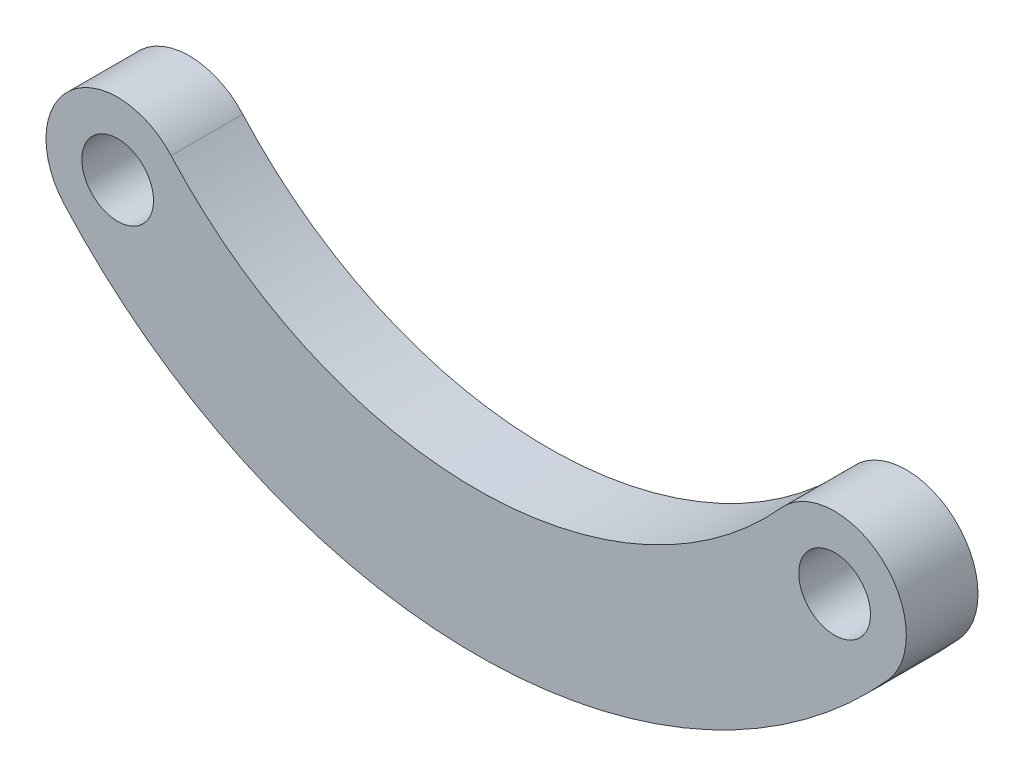
ISO-10303-21;
HEADER;
FILE_DESCRIPTION(('STEP AP214'),'2;1');
FILE_NAME('part.step','',(''),(''),'','','');
FILE_SCHEMA(('AUTOMOTIVE_DESIGN { 1 0 10303 214 1 1 1 1 }'));
ENDSEC;
DATA;
#1=APPLICATION_CONTEXT('core data for automotive mechanical design processes');
#2=APPLICATION_PROTOCOL_DEFINITION('international standard','automotive_design',2000,#1);
#3=PRODUCT_CONTEXT('',#1,'mechanical');
#4=PRODUCT('Part','Part','',(#3));
#5=PRODUCT_RELATED_PRODUCT_CATEGORY('part','',(#4));
#6=PRODUCT_DEFINITION_FORMATION('','',#4);
#7=PRODUCT_DEFINITION_CONTEXT('part definition',#1,'design');
#8=PRODUCT_DEFINITION('design','',#6,#7);
#9=PRODUCT_DEFINITION_SHAPE('','',#8);
#10=(LENGTH_UNIT() NAMED_UNIT(*) SI_UNIT(.MILLI.,.METRE.));
#11=(NAMED_UNIT(*) PLANE_ANGLE_UNIT() SI_UNIT($,.RADIAN.));
#12=(NAMED_UNIT(*) SI_UNIT($,.STERADIAN.) SOLID_ANGLE_UNIT());
#13=UNCERTAINTY_MEASURE_WITH_UNIT(LENGTH_MEASURE(1.E-05),#10,'distance_accuracy_value','');
#14=(GEOMETRIC_REPRESENTATION_CONTEXT(3) GLOBAL_UNCERTAINTY_ASSIGNED_CONTEXT((#13)) GLOBAL_UNIT_ASSIGNED_CONTEXT((#10,
#11,#12)) REPRESENTATION_CONTEXT('',''));
#15=CARTESIAN_POINT('',(0.,0.,0.));
#16=DIRECTION('',(0.,0.,1.));
#17=DIRECTION('',(1.,0.,0.));
#18=AXIS2_PLACEMENT_3D('',#15,#16,#17);
#19=CARTESIAN_POINT('',(-47.625,-42.6471224925101,19.05));
#20=DIRECTION('',(0.,0.,-1.));
#21=DIRECTION('',(-1.,0.,0.));
#22=AXIS2_PLACEMENT_3D('',#19,#20,#21);
#23=PLANE('',#22);
#24=CARTESIAN_POINT('',(0.,0.,19.05));
#25=DIRECTION('',(0.,0.,-1.));
#26=DIRECTION('',(-1.,0.,0.));
#27=AXIS2_PLACEMENT_3D('',#24,#25,#26);
#28=CIRCLE('',#27,108.808010025045);
#29=CARTESIAN_POINT('',(81.0583783750071,-72.585965178019,19.05));
#30=VERTEX_POINT('',#29);
#31=CARTESIAN_POINT('',(-81.058378375007,-72.585965178019,19.05));
#32=VERTEX_POINT('',#31);
#33=EDGE_CURVE('E89',#30,#32,#28,.T.);
#34=ORIENTED_EDGE('',*,*,#33,.T.);
#35=CARTESIAN_POINT('',(-95.25,-85.2942449850201,19.05));
#36=DIRECTION('',(0.,0.,1.));
#37=DIRECTION('',(1.,0.,0.));
#38=AXIS2_PLACEMENT_3D('',#35,#36,#37);
#39=CIRCLE('',#38,19.05);
#40=CARTESIAN_POINT('',(-109.441621624993,-98.0025247920213,19.05));
#41=VERTEX_POINT('',#40);
#42=EDGE_CURVE('E84',#32,#41,#39,.T.);
#43=ORIENTED_EDGE('',*,*,#42,.T.);
#44=CARTESIAN_POINT('',(0.,0.,19.05));
#45=DIRECTION('',(0.,0.,1.));
#46=DIRECTION('',(-1.,0.,0.));
#47=AXIS2_PLACEMENT_3D('',#44,#45,#46);
#48=CIRCLE('',#47,146.908010025045);
#49=CARTESIAN_POINT('',(109.441621624993,-98.0025247920212,19.05));
#50=VERTEX_POINT('',#49);
#51=EDGE_CURVE('E87',#41,#50,#48,.T.);
#52=ORIENTED_EDGE('',*,*,#51,.T.);
#53=CARTESIAN_POINT('',(95.2499999999999,-85.2942449850203,19.05));
#54=DIRECTION('',(0.,0.,1.));
#55=DIRECTION('',(-1.,0.,0.));
#56=AXIS2_PLACEMENT_3D('',#53,#54,#55);
#57=CIRCLE('',#56,19.05);
#58=EDGE_CURVE('E54',#50,#30,#57,.T.);
#59=ORIENTED_EDGE('',*,*,#58,.T.);
#60=EDGE_LOOP('',(#34,#43,#52,#59));
#61=FACE_BOUND('',#60,.T.);
#62=CARTESIAN_POINT('',(-95.25,-85.2942449850201,19.05));
#63=DIRECTION('',(0.,0.,1.));
#64=DIRECTION('',(1.,0.,0.));
#65=AXIS2_PLACEMENT_3D('',#62,#63,#64);
#66=CIRCLE('',#65,9.52500000000001);
#67=CARTESIAN_POINT('',(-104.775,-85.2942449850201,19.05));
#68=VERTEX_POINT('',#67);
#69=EDGE_CURVE('E104',#68,#68,#66,.T.);
#70=ORIENTED_EDGE('',*,*,#69,.F.);
#71=EDGE_LOOP('',(#70));
#72=FACE_BOUND('',#71,.T.);
#73=CARTESIAN_POINT('',(95.2499999999999,-85.2942449850203,19.05));
#74=DIRECTION('',(0.,0.,1.));
#75=DIRECTION('',(-1.,0.,0.));
#76=AXIS2_PLACEMENT_3D('',#73,#74,#75);
#77=CIRCLE('',#76,9.52500000000001);
#78=CARTESIAN_POINT('',(85.7249999999999,-85.2942449850203,19.05));
#79=VERTEX_POINT('',#78);
#80=EDGE_CURVE('E119',#79,#79,#77,.T.);
#81=ORIENTED_EDGE('',*,*,#80,.F.);
#82=EDGE_LOOP('',(#81));
#83=FACE_BOUND('',#82,.T.);
#84=ADVANCED_FACE('F37',(#61,#72,#83),#23,.F.);
#85=CARTESIAN_POINT('',(-47.625,-42.6471224925101,0.));
#86=DIRECTION('',(0.,0.,-1.));
#87=DIRECTION('',(-1.,0.,0.));
#88=AXIS2_PLACEMENT_3D('',#85,#86,#87);
#89=PLANE('',#88);
#90=CARTESIAN_POINT('',(-95.25,-85.2942449850201,0.));
#91=DIRECTION('',(0.,0.,1.));
#92=DIRECTION('',(1.,0.,0.));
#93=AXIS2_PLACEMENT_3D('',#90,#91,#92);
#94=CIRCLE('',#93,9.52500000000001);
#95=CARTESIAN_POINT('',(-104.775,-85.2942449850201,0.));
#96=VERTEX_POINT('',#95);
#97=EDGE_CURVE('E116',#96,#96,#94,.T.);
#98=ORIENTED_EDGE('',*,*,#97,.T.);
#99=EDGE_LOOP('',(#98));
#100=FACE_BOUND('',#99,.T.);
#101=CARTESIAN_POINT('',(0.,0.,0.));
#102=DIRECTION('',(0.,0.,-1.));
#103=DIRECTION('',(-1.,0.,0.));
#104=AXIS2_PLACEMENT_3D('',#101,#102,#103);
#105=CIRCLE('',#104,108.808010025045);
#106=CARTESIAN_POINT('',(81.0583783750071,-72.585965178019,0.));
#107=VERTEX_POINT('',#106);
#108=CARTESIAN_POINT('',(-81.058378375007,-72.585965178019,0.));
#109=VERTEX_POINT('',#108);
#110=EDGE_CURVE('E101',#107,#109,#105,.T.);
#111=ORIENTED_EDGE('',*,*,#110,.F.);
#112=CARTESIAN_POINT('',(95.2499999999999,-85.2942449850203,0.));
#113=DIRECTION('',(0.,0.,1.));
#114=DIRECTION('',(-1.,0.,0.));
#115=AXIS2_PLACEMENT_3D('',#112,#113,#114);
#116=CIRCLE('',#115,19.05);
#117=CARTESIAN_POINT('',(109.441621624993,-98.0025247920212,0.));
#118=VERTEX_POINT('',#117);
#119=EDGE_CURVE('E77',#118,#107,#116,.T.);
#120=ORIENTED_EDGE('',*,*,#119,.F.);
#121=CARTESIAN_POINT('',(0.,0.,0.));
#122=DIRECTION('',(0.,0.,1.));
#123=DIRECTION('',(-1.,0.,0.));
#124=AXIS2_PLACEMENT_3D('',#121,#122,#123);
#125=CIRCLE('',#124,146.908010025045);
#126=CARTESIAN_POINT('',(-109.441621624993,-98.0025247920213,0.));
#127=VERTEX_POINT('',#126);
#128=EDGE_CURVE('E71',#127,#118,#125,.T.);
#129=ORIENTED_EDGE('',*,*,#128,.F.);
#130=CARTESIAN_POINT('',(-95.25,-85.2942449850201,0.));
#131=DIRECTION('',(0.,0.,1.));
#132=DIRECTION('',(1.,0.,0.));
#133=AXIS2_PLACEMENT_3D('',#130,#131,#132);
#134=CIRCLE('',#133,19.05);
#135=EDGE_CURVE('E93',#109,#127,#134,.T.);
#136=ORIENTED_EDGE('',*,*,#135,.F.);
#137=EDGE_LOOP('',(#111,#120,#129,#136));
#138=FACE_BOUND('',#137,.T.);
#139=CARTESIAN_POINT('',(95.2499999999999,-85.2942449850203,0.));
#140=DIRECTION('',(0.,0.,1.));
#141=DIRECTION('',(-1.,0.,0.));
#142=AXIS2_PLACEMENT_3D('',#139,#140,#141);
#143=CIRCLE('',#142,9.52500000000001);
#144=CARTESIAN_POINT('',(85.7249999999999,-85.2942449850203,0.));
#145=VERTEX_POINT('',#144);
#146=EDGE_CURVE('E122',#145,#145,#143,.T.);
#147=ORIENTED_EDGE('',*,*,#146,.T.);
#148=EDGE_LOOP('',(#147));
#149=FACE_BOUND('',#148,.T.);
#150=ADVANCED_FACE('F112',(#100,#138,#149),#89,.T.);
#151=CARTESIAN_POINT('',(0.,0.,19.05));
#152=DIRECTION('',(0.,0.,-1.));
#153=DIRECTION('',(-1.,0.,0.));
#154=AXIS2_PLACEMENT_3D('',#151,#152,#153);
#155=CYLINDRICAL_SURFACE('',#154,108.808010025045);
#156=ORIENTED_EDGE('',*,*,#110,.T.);
#157=DIRECTION('',(0.,0.,-1.));
#158=VECTOR('',#157,1.);
#159=CARTESIAN_POINT('',(-81.058378375007,-72.585965178019,19.05));
#160=LINE('',#159,#158);
#161=EDGE_CURVE('E11',#32,#109,#160,.T.);
#162=ORIENTED_EDGE('',*,*,#161,.F.);
#163=ORIENTED_EDGE('',*,*,#33,.F.);
#164=DIRECTION('',(0.,0.,-1.));
#165=VECTOR('',#164,1.);
#166=CARTESIAN_POINT('',(81.0583783750071,-72.585965178019,19.05));
#167=LINE('',#166,#165);
#168=EDGE_CURVE('E97',#30,#107,#167,.T.);
#169=ORIENTED_EDGE('',*,*,#168,.T.);
#170=EDGE_LOOP('',(#156,#162,#163,#169));
#171=FACE_BOUND('',#170,.T.);
#172=ADVANCED_FACE('F39',(#171),#155,.F.);
#173=CARTESIAN_POINT('',(-95.25,-85.2942449850201,19.05));
#174=DIRECTION('',(0.,0.,-1.));
#175=DIRECTION('',(-1.,0.,0.));
#176=AXIS2_PLACEMENT_3D('',#173,#174,#175);
#177=CYLINDRICAL_SURFACE('',#176,19.05);
#178=ORIENTED_EDGE('',*,*,#135,.T.);
#179=DIRECTION('',(0.,0.,-1.));
#180=VECTOR('',#179,1.);
#181=CARTESIAN_POINT('',(-109.441621624993,-98.0025247920213,19.05));
#182=LINE('',#181,#180);
#183=EDGE_CURVE('E46',#41,#127,#182,.T.);
#184=ORIENTED_EDGE('',*,*,#183,.F.);
#185=ORIENTED_EDGE('',*,*,#42,.F.);
#186=ORIENTED_EDGE('',*,*,#161,.T.);
#187=EDGE_LOOP('',(#178,#184,#185,#186));
#188=FACE_BOUND('',#187,.T.);
#189=ADVANCED_FACE('F92',(#188),#177,.T.);
#190=CARTESIAN_POINT('',(0.,0.,19.05));
#191=DIRECTION('',(0.,0.,-1.));
#192=DIRECTION('',(-1.,0.,0.));
#193=AXIS2_PLACEMENT_3D('',#190,#191,#192);
#194=CYLINDRICAL_SURFACE('',#193,146.908010025045);
#195=ORIENTED_EDGE('',*,*,#128,.T.);
#196=DIRECTION('',(0.,0.,-1.));
#197=VECTOR('',#196,1.);
#198=CARTESIAN_POINT('',(109.441621624993,-98.0025247920212,19.05));
#199=LINE('',#198,#197);
#200=EDGE_CURVE('E94',#50,#118,#199,.T.);
#201=ORIENTED_EDGE('',*,*,#200,.F.);
#202=ORIENTED_EDGE('',*,*,#51,.F.);
#203=ORIENTED_EDGE('',*,*,#183,.T.);
#204=EDGE_LOOP('',(#195,#201,#202,#203));
#205=FACE_BOUND('',#204,.T.);
#206=ADVANCED_FACE('F95',(#205),#194,.T.);
#207=CARTESIAN_POINT('',(95.2499999999999,-85.2942449850203,19.05));
#208=DIRECTION('',(0.,0.,-1.));
#209=DIRECTION('',(-1.,0.,0.));
#210=AXIS2_PLACEMENT_3D('',#207,#208,#209);
#211=CYLINDRICAL_SURFACE('',#210,19.05);
#212=ORIENTED_EDGE('',*,*,#119,.T.);
#213=ORIENTED_EDGE('',*,*,#168,.F.);
#214=ORIENTED_EDGE('',*,*,#58,.F.);
#215=ORIENTED_EDGE('',*,*,#200,.T.);
#216=EDGE_LOOP('',(#212,#213,#214,#215));
#217=FACE_BOUND('',#216,.T.);
#218=ADVANCED_FACE('F109',(#217),#211,.T.);
#219=CARTESIAN_POINT('',(-95.25,-85.2942449850201,19.05));
#220=DIRECTION('',(0.,0.,-1.));
#221=DIRECTION('',(-1.,0.,0.));
#222=AXIS2_PLACEMENT_3D('',#219,#220,#221);
#223=CYLINDRICAL_SURFACE('',#222,9.52500000000001);
#224=CARTESIAN_POINT('',(-104.775,-85.2942449850201,19.05));
#225=CARTESIAN_POINT('',(-104.775,-85.2942449850201,18.8515625));
#226=CARTESIAN_POINT('',(-104.775,-85.2942449850201,18.653125));
#227=CARTESIAN_POINT('',(-104.775,-85.2942449850201,18.25625));
#228=CARTESIAN_POINT('',(-104.775,-85.2942449850201,18.0578125));
#229=CARTESIAN_POINT('',(-104.775,-85.2942449850201,17.6609375));
#230=CARTESIAN_POINT('',(-104.775,-85.2942449850201,17.4625));
#231=CARTESIAN_POINT('',(-104.775,-85.2942449850201,17.065625));
#232=CARTESIAN_POINT('',(-104.775,-85.2942449850201,16.8671875));
#233=CARTESIAN_POINT('',(-104.775,-85.2942449850201,16.4703125));
#234=CARTESIAN_POINT('',(-104.775,-85.2942449850201,16.271875));
#235=CARTESIAN_POINT('',(-104.775,-85.2942449850201,15.875));
#236=CARTESIAN_POINT('',(-104.775,-85.2942449850201,15.6765625));
#237=CARTESIAN_POINT('',(-104.775,-85.2942449850201,15.2796875));
#238=CARTESIAN_POINT('',(-104.775,-85.2942449850201,15.08125));
#239=CARTESIAN_POINT('',(-104.775,-85.2942449850201,14.684375));
#240=CARTESIAN_POINT('',(-104.775,-85.2942449850201,14.4859375));
#241=CARTESIAN_POINT('',(-104.775,-85.2942449850201,14.0890625));
#242=CARTESIAN_POINT('',(-104.775,-85.2942449850201,13.890625));
#243=CARTESIAN_POINT('',(-104.775,-85.2942449850201,13.49375));
#244=CARTESIAN_POINT('',(-104.775,-85.2942449850201,13.2953125));
#245=CARTESIAN_POINT('',(-104.775,-85.2942449850201,12.8984375));
#246=CARTESIAN_POINT('',(-104.775,-85.2942449850201,12.7));
#247=CARTESIAN_POINT('',(-104.775,-85.2942449850201,12.303125));
#248=CARTESIAN_POINT('',(-104.775,-85.2942449850201,12.1046875));
#249=CARTESIAN_POINT('',(-104.775,-85.2942449850201,11.7078125));
#250=CARTESIAN_POINT('',(-104.775,-85.2942449850201,11.509375));
#251=CARTESIAN_POINT('',(-104.775,-85.2942449850201,11.1125));
#252=CARTESIAN_POINT('',(-104.775,-85.2942449850201,10.9140625));
#253=CARTESIAN_POINT('',(-104.775,-85.2942449850201,10.5171875));
#254=CARTESIAN_POINT('',(-104.775,-85.2942449850201,10.31875));
#255=CARTESIAN_POINT('',(-104.775,-85.2942449850201,9.921875));
#256=CARTESIAN_POINT('',(-104.775,-85.2942449850201,9.7234375));
#257=CARTESIAN_POINT('',(-104.775,-85.2942449850201,9.3265625));
#258=CARTESIAN_POINT('',(-104.775,-85.2942449850201,9.128125));
#259=CARTESIAN_POINT('',(-104.775,-85.2942449850201,8.73125));
#260=CARTESIAN_POINT('',(-104.775,-85.2942449850201,8.5328125));
#261=CARTESIAN_POINT('',(-104.775,-85.2942449850201,8.1359375));
#262=CARTESIAN_POINT('',(-104.775,-85.2942449850201,7.9375));
#263=CARTESIAN_POINT('',(-104.775,-85.2942449850201,7.540625));
#264=CARTESIAN_POINT('',(-104.775,-85.2942449850201,7.3421875));
#265=CARTESIAN_POINT('',(-104.775,-85.2942449850201,6.9453125));
#266=CARTESIAN_POINT('',(-104.775,-85.2942449850201,6.746875));
#267=CARTESIAN_POINT('',(-104.775,-85.2942449850201,6.35));
#268=CARTESIAN_POINT('',(-104.775,-85.2942449850201,6.1515625));
#269=CARTESIAN_POINT('',(-104.775,-85.2942449850201,5.7546875));
#270=CARTESIAN_POINT('',(-104.775,-85.2942449850201,5.55625));
#271=CARTESIAN_POINT('',(-104.775,-85.2942449850201,5.159375));
#272=CARTESIAN_POINT('',(-104.775,-85.2942449850201,4.9609375));
#273=CARTESIAN_POINT('',(-104.775,-85.2942449850201,4.5640625));
#274=CARTESIAN_POINT('',(-104.775,-85.2942449850201,4.365625));
#275=CARTESIAN_POINT('',(-104.775,-85.2942449850201,3.96875));
#276=CARTESIAN_POINT('',(-104.775,-85.2942449850201,3.7703125));
#277=CARTESIAN_POINT('',(-104.775,-85.2942449850201,3.3734375));
#278=CARTESIAN_POINT('',(-104.775,-85.2942449850201,3.175));
#279=CARTESIAN_POINT('',(-104.775,-85.2942449850201,2.778125));
#280=CARTESIAN_POINT('',(-104.775,-85.2942449850201,2.5796875));
#281=CARTESIAN_POINT('',(-104.775,-85.2942449850201,2.1828125));
#282=CARTESIAN_POINT('',(-104.775,-85.2942449850201,1.984375));
#283=CARTESIAN_POINT('',(-104.775,-85.2942449850201,1.5875));
#284=CARTESIAN_POINT('',(-104.775,-85.2942449850201,1.3890625));
#285=CARTESIAN_POINT('',(-104.775,-85.2942449850201,0.992187500000001));
#286=CARTESIAN_POINT('',(-104.775,-85.2942449850201,0.793750000000001));
#287=CARTESIAN_POINT('',(-104.775,-85.2942449850201,0.396875));
#288=CARTESIAN_POINT('',(-104.775,-85.2942449850201,0.1984375));
#289=CARTESIAN_POINT('',(-104.775,-85.2942449850201,0.));
#290=B_SPLINE_CURVE_WITH_KNOTS('',3,(#224,#225,#226,#227,#228,#229,#230,#231,#232,#233,#234,
#235,#236,#237,#238,#239,#240,#241,#242,#243,#244,#245,#246,#247,#248,#249,#250,#251,#252,#253,
#254,#255,#256,#257,#258,#259,#260,#261,#262,#263,#264,#265,#266,#267,#268,#269,#270,#271,#272,
#273,#274,#275,#276,#277,#278,#279,#280,#281,#282,#283,#284,#285,#286,#287,#288,#289),
.UNSPECIFIED.,.F.,.F.,(4,2,2,2,2,2,2,2,2,2,2,2,2,2,2,2,2,2,2,2,2,2,2,2,2,2,2,2,2,2,2,2,4),(0.,
0.5953125,1.190625,1.7859375,2.38125,2.9765625,3.571875,4.1671875,4.7625,5.3578125,5.953125,
6.5484375,7.14375,7.7390625,8.334375,8.9296875,9.525,10.1203125,10.715625,11.3109375,11.90625,
12.5015625,13.096875,13.6921875,14.2875,14.8828125,15.478125,16.0734375,16.66875,17.2640625,
17.859375,18.4546875,19.05),.UNSPECIFIED.);
#291=EDGE_CURVE('BSEAM139',#68,#96,#290,.T.);
#292=ORIENTED_EDGE('',*,*,#69,.T.);
#293=ORIENTED_EDGE('',*,*,#97,.F.);
#294=ORIENTED_EDGE('',*,*,#291,.T.);
#295=ORIENTED_EDGE('',*,*,#291,.F.);
#296=EDGE_LOOP('',(#292,#294,#293,#295));
#297=FACE_BOUND('',#296,.T.);
#298=ADVANCED_FACE('F139',(#297),#223,.F.);
#299=CARTESIAN_POINT('',(95.2499999999999,-85.2942449850203,19.05));
#300=DIRECTION('',(0.,0.,-1.));
#301=DIRECTION('',(-1.,0.,0.));
#302=AXIS2_PLACEMENT_3D('',#299,#300,#301);
#303=CYLINDRICAL_SURFACE('',#302,9.52500000000001);
#304=CARTESIAN_POINT('',(85.7249999999999,-85.2942449850203,19.05));
#305=CARTESIAN_POINT('',(85.7249999999999,-85.2942449850203,18.8515625));
#306=CARTESIAN_POINT('',(85.7249999999999,-85.2942449850203,18.653125));
#307=CARTESIAN_POINT('',(85.7249999999999,-85.2942449850203,18.25625));
#308=CARTESIAN_POINT('',(85.7249999999999,-85.2942449850203,18.0578125));
#309=CARTESIAN_POINT('',(85.7249999999999,-85.2942449850203,17.6609375));
#310=CARTESIAN_POINT('',(85.7249999999999,-85.2942449850203,17.4625));
#311=CARTESIAN_POINT('',(85.7249999999999,-85.2942449850203,17.065625));
#312=CARTESIAN_POINT('',(85.7249999999999,-85.2942449850203,16.8671875));
#313=CARTESIAN_POINT('',(85.7249999999999,-85.2942449850203,16.4703125));
#314=CARTESIAN_POINT('',(85.7249999999999,-85.2942449850203,16.271875));
#315=CARTESIAN_POINT('',(85.7249999999999,-85.2942449850203,15.875));
#316=CARTESIAN_POINT('',(85.7249999999999,-85.2942449850203,15.6765625));
#317=CARTESIAN_POINT('',(85.7249999999999,-85.2942449850203,15.2796875));
#318=CARTESIAN_POINT('',(85.7249999999999,-85.2942449850203,15.08125));
#319=CARTESIAN_POINT('',(85.7249999999999,-85.2942449850203,14.684375));
#320=CARTESIAN_POINT('',(85.7249999999999,-85.2942449850203,14.4859375));
#321=CARTESIAN_POINT('',(85.7249999999999,-85.2942449850203,14.0890625));
#322=CARTESIAN_POINT('',(85.7249999999999,-85.2942449850203,13.890625));
#323=CARTESIAN_POINT('',(85.7249999999999,-85.2942449850203,13.49375));
#324=CARTESIAN_POINT('',(85.7249999999999,-85.2942449850203,13.2953125));
#325=CARTESIAN_POINT('',(85.7249999999999,-85.2942449850203,12.8984375));
#326=CARTESIAN_POINT('',(85.7249999999999,-85.2942449850203,12.7));
#327=CARTESIAN_POINT('',(85.7249999999999,-85.2942449850203,12.303125));
#328=CARTESIAN_POINT('',(85.7249999999999,-85.2942449850203,12.1046875));
#329=CARTESIAN_POINT('',(85.7249999999999,-85.2942449850203,11.7078125));
#330=CARTESIAN_POINT('',(85.7249999999999,-85.2942449850203,11.509375));
#331=CARTESIAN_POINT('',(85.7249999999999,-85.2942449850203,11.1125));
#332=CARTESIAN_POINT('',(85.7249999999999,-85.2942449850203,10.9140625));
#333=CARTESIAN_POINT('',(85.7249999999999,-85.2942449850203,10.5171875));
#334=CARTESIAN_POINT('',(85.7249999999999,-85.2942449850203,10.31875));
#335=CARTESIAN_POINT('',(85.7249999999999,-85.2942449850203,9.921875));
#336=CARTESIAN_POINT('',(85.7249999999999,-85.2942449850203,9.7234375));
#337=CARTESIAN_POINT('',(85.7249999999999,-85.2942449850203,9.3265625));
#338=CARTESIAN_POINT('',(85.7249999999999,-85.2942449850203,9.128125));
#339=CARTESIAN_POINT('',(85.7249999999999,-85.2942449850203,8.73125));
#340=CARTESIAN_POINT('',(85.7249999999999,-85.2942449850203,8.5328125));
#341=CARTESIAN_POINT('',(85.7249999999999,-85.2942449850203,8.1359375));
#342=CARTESIAN_POINT('',(85.7249999999999,-85.2942449850203,7.9375));
#343=CARTESIAN_POINT('',(85.7249999999999,-85.2942449850203,7.540625));
#344=CARTESIAN_POINT('',(85.7249999999999,-85.2942449850203,7.3421875));
#345=CARTESIAN_POINT('',(85.7249999999999,-85.2942449850203,6.9453125));
#346=CARTESIAN_POINT('',(85.7249999999999,-85.2942449850203,6.746875));
#347=CARTESIAN_POINT('',(85.7249999999999,-85.2942449850203,6.35));
#348=CARTESIAN_POINT('',(85.7249999999999,-85.2942449850203,6.1515625));
#349=CARTESIAN_POINT('',(85.7249999999999,-85.2942449850203,5.7546875));
#350=CARTESIAN_POINT('',(85.7249999999999,-85.2942449850203,5.55625));
#351=CARTESIAN_POINT('',(85.7249999999999,-85.2942449850203,5.159375));
#352=CARTESIAN_POINT('',(85.7249999999999,-85.2942449850203,4.9609375));
#353=CARTESIAN_POINT('',(85.7249999999999,-85.2942449850203,4.5640625));
#354=CARTESIAN_POINT('',(85.7249999999999,-85.2942449850203,4.365625));
#355=CARTESIAN_POINT('',(85.7249999999999,-85.2942449850203,3.96875));
#356=CARTESIAN_POINT('',(85.7249999999999,-85.2942449850203,3.7703125));
#357=CARTESIAN_POINT('',(85.7249999999999,-85.2942449850203,3.3734375));
#358=CARTESIAN_POINT('',(85.7249999999999,-85.2942449850203,3.175));
#359=CARTESIAN_POINT('',(85.7249999999999,-85.2942449850203,2.778125));
#360=CARTESIAN_POINT('',(85.7249999999999,-85.2942449850203,2.5796875));
#361=CARTESIAN_POINT('',(85.7249999999999,-85.2942449850203,2.1828125));
#362=CARTESIAN_POINT('',(85.7249999999999,-85.2942449850203,1.984375));
#363=CARTESIAN_POINT('',(85.7249999999999,-85.2942449850203,1.5875));
#364=CARTESIAN_POINT('',(85.7249999999999,-85.2942449850203,1.3890625));
#365=CARTESIAN_POINT('',(85.7249999999999,-85.2942449850203,0.992187500000001));
#366=CARTESIAN_POINT('',(85.7249999999999,-85.2942449850203,0.793750000000001));
#367=CARTESIAN_POINT('',(85.7249999999999,-85.2942449850203,0.396875));
#368=CARTESIAN_POINT('',(85.7249999999999,-85.2942449850203,0.1984375));
#369=CARTESIAN_POINT('',(85.7249999999999,-85.2942449850203,0.));
#370=B_SPLINE_CURVE_WITH_KNOTS('',3,(#304,#305,#306,#307,#308,#309,#310,#311,#312,#313,#314,
#315,#316,#317,#318,#319,#320,#321,#322,#323,#324,#325,#326,#327,#328,#329,#330,#331,#332,#333,
#334,#335,#336,#337,#338,#339,#340,#341,#342,#343,#344,#345,#346,#347,#348,#349,#350,#351,#352,
#353,#354,#355,#356,#357,#358,#359,#360,#361,#362,#363,#364,#365,#366,#367,#368,#369),
.UNSPECIFIED.,.F.,.F.,(4,2,2,2,2,2,2,2,2,2,2,2,2,2,2,2,2,2,2,2,2,2,2,2,2,2,2,2,2,2,2,2,4),(0.,
0.5953125,1.190625,1.7859375,2.38125,2.9765625,3.571875,4.1671875,4.7625,5.3578125,5.953125,
6.5484375,7.14375,7.7390625,8.334375,8.9296875,9.525,10.1203125,10.715625,11.3109375,11.90625,
12.5015625,13.096875,13.6921875,14.2875,14.8828125,15.478125,16.0734375,16.66875,17.2640625,
17.859375,18.4546875,19.05),.UNSPECIFIED.);
#371=EDGE_CURVE('BSEAM128',#79,#145,#370,.T.);
#372=ORIENTED_EDGE('',*,*,#80,.T.);
#373=ORIENTED_EDGE('',*,*,#146,.F.);
#374=ORIENTED_EDGE('',*,*,#371,.T.);
#375=ORIENTED_EDGE('',*,*,#371,.F.);
#376=EDGE_LOOP('',(#372,#374,#373,#375));
#377=FACE_BOUND('',#376,.T.);
#378=ADVANCED_FACE('F128',(#377),#303,.F.);
#379=CLOSED_SHELL('',(#84,#150,#172,#189,#206,#218,#298,#378));
#380=MANIFOLD_SOLID_BREP('B2',#379);
#381=ADVANCED_BREP_SHAPE_REPRESENTATION('',(#18,#380),#14);
#382=SHAPE_DEFINITION_REPRESENTATION(#9,#381);
ENDSEC;
END-ISO-10303-21;
